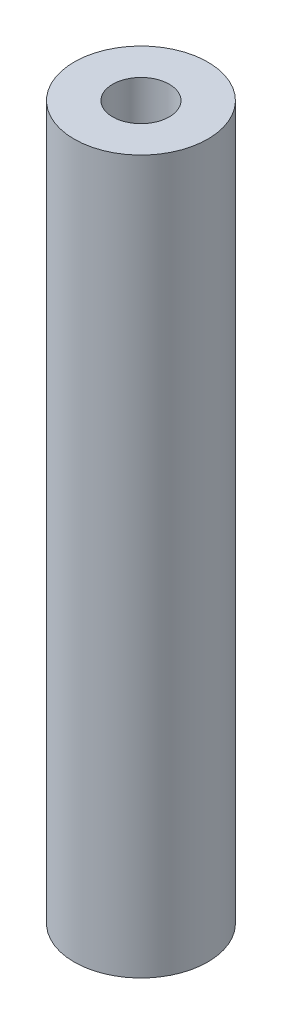
ISO-10303-21;
HEADER;
FILE_DESCRIPTION(('STEP AP214'),'2;1');
FILE_NAME('part.step','',(''),(''),'','','');
FILE_SCHEMA(('AUTOMOTIVE_DESIGN { 1 0 10303 214 1 1 1 1 }'));
ENDSEC;
DATA;
#1=APPLICATION_CONTEXT('core data for automotive mechanical design processes');
#2=APPLICATION_PROTOCOL_DEFINITION('international standard','automotive_design',2000,#1);
#3=PRODUCT_CONTEXT('',#1,'mechanical');
#4=PRODUCT('Part','Part','',(#3));
#5=PRODUCT_RELATED_PRODUCT_CATEGORY('part','',(#4));
#6=PRODUCT_DEFINITION_FORMATION('','',#4);
#7=PRODUCT_DEFINITION_CONTEXT('part definition',#1,'design');
#8=PRODUCT_DEFINITION('design','',#6,#7);
#9=PRODUCT_DEFINITION_SHAPE('','',#8);
#10=(LENGTH_UNIT() NAMED_UNIT(*) SI_UNIT(.MILLI.,.METRE.));
#11=(NAMED_UNIT(*) PLANE_ANGLE_UNIT() SI_UNIT($,.RADIAN.));
#12=(NAMED_UNIT(*) SI_UNIT($,.STERADIAN.) SOLID_ANGLE_UNIT());
#13=UNCERTAINTY_MEASURE_WITH_UNIT(LENGTH_MEASURE(1.E-05),#10,'distance_accuracy_value','');
#14=(GEOMETRIC_REPRESENTATION_CONTEXT(3) GLOBAL_UNCERTAINTY_ASSIGNED_CONTEXT((#13)) GLOBAL_UNIT_ASSIGNED_CONTEXT((#10,
#11,#12)) REPRESENTATION_CONTEXT('',''));
#15=CARTESIAN_POINT('',(0.,0.,0.));
#16=DIRECTION('',(0.,0.,1.));
#17=DIRECTION('',(1.,0.,0.));
#18=AXIS2_PLACEMENT_3D('',#15,#16,#17);
#19=CARTESIAN_POINT('',(0.,25.4,0.));
#20=DIRECTION('',(0.,-1.,0.));
#21=DIRECTION('',(0.,0.,-1.));
#22=AXIS2_PLACEMENT_3D('',#19,#20,#21);
#23=CYLINDRICAL_SURFACE('',#22,4.7625);
#24=CARTESIAN_POINT('',(0.,25.4,0.));
#25=DIRECTION('',(0.,1.,0.));
#26=DIRECTION('',(0.,0.,1.));
#27=AXIS2_PLACEMENT_3D('',#24,#25,#26);
#28=CIRCLE('',#27,4.7625);
#29=CARTESIAN_POINT('',(0.,25.4,4.7625));
#30=VERTEX_POINT('',#29);
#31=EDGE_CURVE('E11',#30,#30,#28,.T.);
#32=ORIENTED_EDGE('',*,*,#31,.F.);
#33=EDGE_LOOP('',(#32));
#34=FACE_BOUND('',#33,.T.);
#35=CARTESIAN_POINT('',(0.,-25.4,0.));
#36=DIRECTION('',(0.,1.,0.));
#37=DIRECTION('',(0.,0.,1.));
#38=AXIS2_PLACEMENT_3D('',#35,#36,#37);
#39=CIRCLE('',#38,4.7625);
#40=CARTESIAN_POINT('',(0.,-25.4,4.7625));
#41=VERTEX_POINT('',#40);
#42=EDGE_CURVE('E48',#41,#41,#39,.T.);
#43=ORIENTED_EDGE('',*,*,#42,.T.);
#44=EDGE_LOOP('',(#43));
#45=FACE_BOUND('',#44,.T.);
#46=ADVANCED_FACE('F45',(#34,#45),#23,.T.);
#47=CARTESIAN_POINT('',(0.,25.4,0.));
#48=DIRECTION('',(0.,1.,0.));
#49=DIRECTION('',(0.,0.,1.));
#50=AXIS2_PLACEMENT_3D('',#47,#48,#49);
#51=PLANE('',#50);
#52=CARTESIAN_POINT('',(0.,25.4,0.));
#53=DIRECTION('',(0.,1.,0.));
#54=DIRECTION('',(0.,0.,1.));
#55=AXIS2_PLACEMENT_3D('',#52,#53,#54);
#56=CIRCLE('',#55,2.01929999999999);
#57=CARTESIAN_POINT('',(0.,25.4,2.01929999999999));
#58=VERTEX_POINT('',#57);
#59=EDGE_CURVE('E68',#58,#58,#56,.T.);
#60=ORIENTED_EDGE('',*,*,#59,.F.);
#61=EDGE_LOOP('',(#60));
#62=FACE_BOUND('',#61,.T.);
#63=ORIENTED_EDGE('',*,*,#31,.T.);
#64=EDGE_LOOP('',(#63));
#65=FACE_BOUND('',#64,.T.);
#66=ADVANCED_FACE('F87',(#62,#65),#51,.T.);
#67=CARTESIAN_POINT('',(0.,-25.4,0.));
#68=DIRECTION('',(0.,1.,0.));
#69=DIRECTION('',(0.,0.,1.));
#70=AXIS2_PLACEMENT_3D('',#67,#68,#69);
#71=PLANE('',#70);
#72=CARTESIAN_POINT('',(0.,-25.4,0.));
#73=DIRECTION('',(0.,-1.,0.));
#74=DIRECTION('',(0.,0.,-1.));
#75=AXIS2_PLACEMENT_3D('',#72,#73,#74);
#76=CIRCLE('',#75,2.01929999999999);
#77=CARTESIAN_POINT('',(0.,-25.4,-2.01929999999999));
#78=VERTEX_POINT('',#77);
#79=EDGE_CURVE('E69',#78,#78,#76,.T.);
#80=ORIENTED_EDGE('',*,*,#79,.F.);
#81=EDGE_LOOP('',(#80));
#82=FACE_BOUND('',#81,.T.);
#83=ORIENTED_EDGE('',*,*,#42,.F.);
#84=EDGE_LOOP('',(#83));
#85=FACE_BOUND('',#84,.T.);
#86=ADVANCED_FACE('F84',(#82,#85),#71,.F.);
#87=CARTESIAN_POINT('',(0.,13.462,0.));
#88=DIRECTION('',(0.,1.,0.));
#89=DIRECTION('',(0.,0.,1.));
#90=AXIS2_PLACEMENT_3D('',#87,#88,#89);
#91=CONICAL_SURFACE('',#90,2.0193,1.02974425867665);
#92=CARTESIAN_POINT('',(0.,12.2486821519976,0.));
#93=VERTEX_POINT('',#92);
#94=VERTEX_LOOP('',#93);
#95=FACE_BOUND('',#94,.T.);
#96=CARTESIAN_POINT('',(0.,13.462,0.));
#97=DIRECTION('',(0.,1.,0.));
#98=DIRECTION('',(0.,0.,1.));
#99=AXIS2_PLACEMENT_3D('',#96,#97,#98);
#100=CIRCLE('',#99,2.0193);
#101=CARTESIAN_POINT('',(0.,13.462,2.0193));
#102=VERTEX_POINT('',#101);
#103=EDGE_CURVE('E72',#102,#102,#100,.T.);
#104=ORIENTED_EDGE('',*,*,#103,.T.);
#105=EDGE_LOOP('',(#104));
#106=FACE_BOUND('',#105,.T.);
#107=ADVANCED_FACE('F86',(#95,#106),#91,.F.);
#108=CARTESIAN_POINT('',(0.,25.4,0.));
#109=DIRECTION('',(0.,1.,0.));
#110=DIRECTION('',(0.,0.,1.));
#111=AXIS2_PLACEMENT_3D('',#108,#109,#110);
#112=CYLINDRICAL_SURFACE('',#111,2.01929999999999);
#113=ORIENTED_EDGE('',*,*,#103,.F.);
#114=EDGE_LOOP('',(#113));
#115=FACE_BOUND('',#114,.T.);
#116=ORIENTED_EDGE('',*,*,#59,.T.);
#117=EDGE_LOOP('',(#116));
#118=FACE_BOUND('',#117,.T.);
#119=ADVANCED_FACE('F62',(#115,#118),#112,.F.);
#120=CARTESIAN_POINT('',(0.,-13.462,0.));
#121=DIRECTION('',(0.,-1.,0.));
#122=DIRECTION('',(0.,0.,-1.));
#123=AXIS2_PLACEMENT_3D('',#120,#121,#122);
#124=CONICAL_SURFACE('',#123,2.0193,1.02974425867665);
#125=CARTESIAN_POINT('',(0.,-12.2486821519976,0.));
#126=VERTEX_POINT('',#125);
#127=VERTEX_LOOP('',#126);
#128=FACE_BOUND('',#127,.T.);
#129=CARTESIAN_POINT('',(0.,-13.462,0.));
#130=DIRECTION('',(0.,-1.,0.));
#131=DIRECTION('',(0.,0.,-1.));
#132=AXIS2_PLACEMENT_3D('',#129,#130,#131);
#133=CIRCLE('',#132,2.0193);
#134=CARTESIAN_POINT('',(0.,-13.462,-2.0193));
#135=VERTEX_POINT('',#134);
#136=EDGE_CURVE('E66',#135,#135,#133,.T.);
#137=ORIENTED_EDGE('',*,*,#136,.T.);
#138=EDGE_LOOP('',(#137));
#139=FACE_BOUND('',#138,.T.);
#140=ADVANCED_FACE('F58',(#128,#139),#124,.F.);
#141=CARTESIAN_POINT('',(0.,-25.4,0.));
#142=DIRECTION('',(0.,-1.,0.));
#143=DIRECTION('',(0.,0.,-1.));
#144=AXIS2_PLACEMENT_3D('',#141,#142,#143);
#145=CYLINDRICAL_SURFACE('',#144,2.01929999999999);
#146=ORIENTED_EDGE('',*,*,#136,.F.);
#147=EDGE_LOOP('',(#146));
#148=FACE_BOUND('',#147,.T.);
#149=ORIENTED_EDGE('',*,*,#79,.T.);
#150=EDGE_LOOP('',(#149));
#151=FACE_BOUND('',#150,.T.);
#152=ADVANCED_FACE('F61',(#148,#151),#145,.F.);
#153=CLOSED_SHELL('',(#46,#66,#86,#107,#119,#140,#152));
#154=MANIFOLD_SOLID_BREP('B2',#153);
#155=ADVANCED_BREP_SHAPE_REPRESENTATION('',(#18,#154),#14);
#156=SHAPE_DEFINITION_REPRESENTATION(#9,#155);
ENDSEC;
END-ISO-10303-21;
